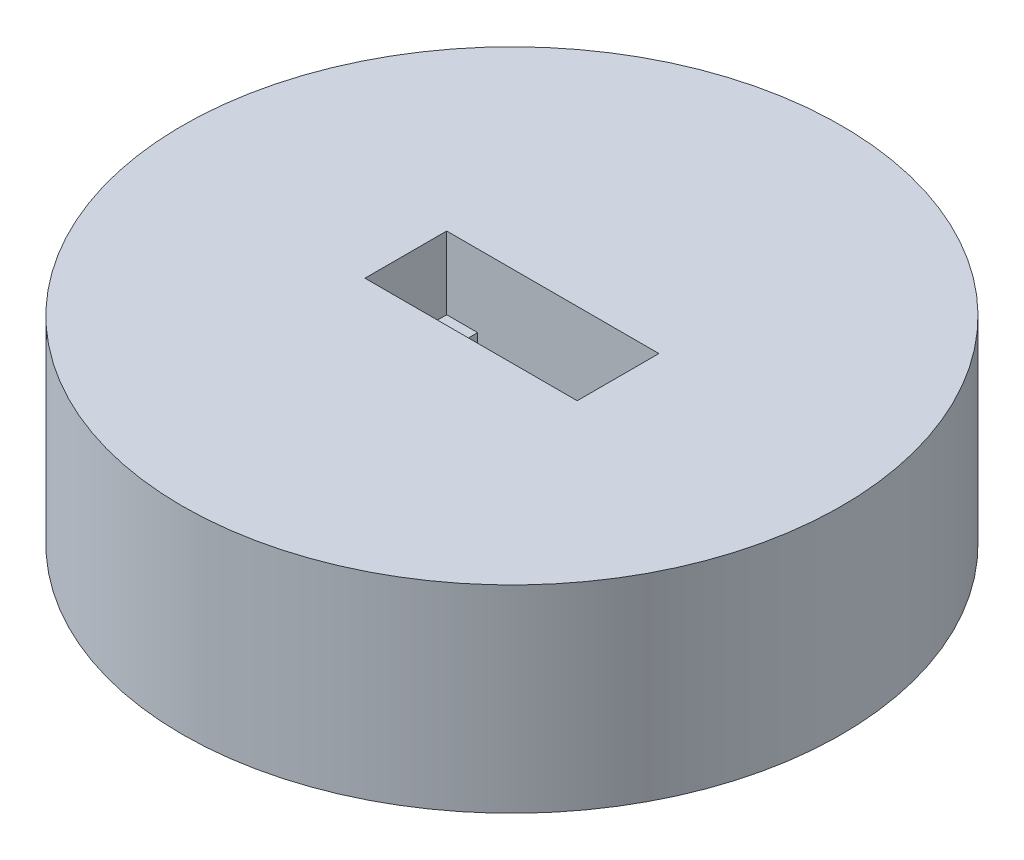
ISO-10303-21;
HEADER;
FILE_DESCRIPTION(('STEP AP214'),'2;1');
FILE_NAME('part.step','',(''),(''),'','','');
FILE_SCHEMA(('AUTOMOTIVE_DESIGN { 1 0 10303 214 1 1 1 1 }'));
ENDSEC;
DATA;
#1=APPLICATION_CONTEXT('core data for automotive mechanical design processes');
#2=APPLICATION_PROTOCOL_DEFINITION('international standard','automotive_design',2000,#1);
#3=PRODUCT_CONTEXT('',#1,'mechanical');
#4=PRODUCT('Part','Part','',(#3));
#5=PRODUCT_RELATED_PRODUCT_CATEGORY('part','',(#4));
#6=PRODUCT_DEFINITION_FORMATION('','',#4);
#7=PRODUCT_DEFINITION_CONTEXT('part definition',#1,'design');
#8=PRODUCT_DEFINITION('design','',#6,#7);
#9=PRODUCT_DEFINITION_SHAPE('','',#8);
#10=(LENGTH_UNIT() NAMED_UNIT(*) SI_UNIT(.MILLI.,.METRE.));
#11=(NAMED_UNIT(*) PLANE_ANGLE_UNIT() SI_UNIT($,.RADIAN.));
#12=(NAMED_UNIT(*) SI_UNIT($,.STERADIAN.) SOLID_ANGLE_UNIT());
#13=UNCERTAINTY_MEASURE_WITH_UNIT(LENGTH_MEASURE(1.E-05),#10,'distance_accuracy_value','');
#14=(GEOMETRIC_REPRESENTATION_CONTEXT(3) GLOBAL_UNCERTAINTY_ASSIGNED_CONTEXT((#13)) GLOBAL_UNIT_ASSIGNED_CONTEXT((#10,
#11,#12)) REPRESENTATION_CONTEXT('',''));
#15=CARTESIAN_POINT('',(0.,0.,0.));
#16=DIRECTION('',(0.,0.,1.));
#17=DIRECTION('',(1.,0.,0.));
#18=AXIS2_PLACEMENT_3D('',#15,#16,#17);
#19=CARTESIAN_POINT('',(-50.,7.5,2.));
#20=DIRECTION('',(0.,0.,1.));
#21=DIRECTION('',(1.,0.,0.));
#22=AXIS2_PLACEMENT_3D('',#19,#20,#21);
#23=PLANE('',#22);
#24=DIRECTION('',(0.,-1.,0.));
#25=VECTOR('',#24,1.);
#26=CARTESIAN_POINT('',(-19.1,7.5,2.));
#27=LINE('',#26,#25);
#28=CARTESIAN_POINT('',(-19.1,9.,2.));
#29=VERTEX_POINT('',#28);
#30=CARTESIAN_POINT('',(-19.1,7.5,2.));
#31=VERTEX_POINT('',#30);
#32=EDGE_CURVE('E66',#29,#31,#27,.T.);
#33=ORIENTED_EDGE('',*,*,#32,.F.);
#34=DIRECTION('',(1.,0.,0.));
#35=VECTOR('',#34,1.);
#36=CARTESIAN_POINT('',(-50.,9.,2.));
#37=LINE('',#36,#35);
#38=CARTESIAN_POINT('',(-11.4,9.,2.));
#39=VERTEX_POINT('',#38);
#40=EDGE_CURVE('E311',#29,#39,#37,.T.);
#41=ORIENTED_EDGE('',*,*,#40,.T.);
#42=DIRECTION('',(0.,1.,0.));
#43=VECTOR('',#42,1.);
#44=CARTESIAN_POINT('',(-11.4,3.,2.));
#45=LINE('',#44,#43);
#46=CARTESIAN_POINT('',(-11.4,7.5,2.));
#47=VERTEX_POINT('',#46);
#48=EDGE_CURVE('E281',#47,#39,#45,.T.);
#49=ORIENTED_EDGE('',*,*,#48,.F.);
#50=DIRECTION('',(1.,0.,0.));
#51=VECTOR('',#50,1.);
#52=CARTESIAN_POINT('',(-50.,7.5,2.));
#53=LINE('',#52,#51);
#54=EDGE_CURVE('E202',#31,#47,#53,.T.);
#55=ORIENTED_EDGE('',*,*,#54,.F.);
#56=EDGE_LOOP('',(#33,#41,#49,#55));
#57=FACE_BOUND('',#56,.T.);
#58=ADVANCED_FACE('F43',(#57),#23,.F.);
#59=CARTESIAN_POINT('',(-50.,9.,-2.));
#60=DIRECTION('',(0.,1.,0.));
#61=DIRECTION('',(0.,0.,1.));
#62=AXIS2_PLACEMENT_3D('',#59,#60,#61);
#63=PLANE('',#62);
#64=DIRECTION('',(0.,0.,1.));
#65=VECTOR('',#64,1.);
#66=CARTESIAN_POINT('',(-19.1,9.,-2.));
#67=LINE('',#66,#65);
#68=CARTESIAN_POINT('',(-19.1,9.,-2.));
#69=VERTEX_POINT('',#68);
#70=EDGE_CURVE('E299',#69,#29,#67,.T.);
#71=ORIENTED_EDGE('',*,*,#70,.F.);
#72=DIRECTION('',(1.,0.,0.));
#73=VECTOR('',#72,1.);
#74=CARTESIAN_POINT('',(-50.,9.,-2.));
#75=LINE('',#74,#73);
#76=CARTESIAN_POINT('',(-11.4,9.,-2.));
#77=VERTEX_POINT('',#76);
#78=EDGE_CURVE('E297',#69,#77,#75,.T.);
#79=ORIENTED_EDGE('',*,*,#78,.T.);
#80=DIRECTION('',(0.,0.,-1.));
#81=VECTOR('',#80,1.);
#82=CARTESIAN_POINT('',(-11.4,9.,-6.2));
#83=LINE('',#82,#81);
#84=EDGE_CURVE('E277',#39,#77,#83,.T.);
#85=ORIENTED_EDGE('',*,*,#84,.F.);
#86=ORIENTED_EDGE('',*,*,#40,.F.);
#87=EDGE_LOOP('',(#71,#79,#85,#86));
#88=FACE_BOUND('',#87,.T.);
#89=ADVANCED_FACE('F310',(#88),#63,.F.);
#90=CARTESIAN_POINT('',(-50.,7.5,-2.));
#91=DIRECTION('',(0.,0.,-1.));
#92=DIRECTION('',(-1.,0.,0.));
#93=AXIS2_PLACEMENT_3D('',#90,#91,#92);
#94=PLANE('',#93);
#95=DIRECTION('',(0.,1.,0.));
#96=VECTOR('',#95,1.);
#97=CARTESIAN_POINT('',(-19.1,7.5,-2.));
#98=LINE('',#97,#96);
#99=CARTESIAN_POINT('',(-19.1,7.5,-2.));
#100=VERTEX_POINT('',#99);
#101=EDGE_CURVE('E287',#100,#69,#98,.T.);
#102=ORIENTED_EDGE('',*,*,#101,.F.);
#103=DIRECTION('',(1.,0.,0.));
#104=VECTOR('',#103,1.);
#105=CARTESIAN_POINT('',(-50.,7.5,-2.));
#106=LINE('',#105,#104);
#107=CARTESIAN_POINT('',(-11.4,7.5,-2.));
#108=VERTEX_POINT('',#107);
#109=EDGE_CURVE('E201',#100,#108,#106,.T.);
#110=ORIENTED_EDGE('',*,*,#109,.T.);
#111=DIRECTION('',(0.,-1.,0.));
#112=VECTOR('',#111,1.);
#113=CARTESIAN_POINT('',(-11.4,3.,-2.));
#114=LINE('',#113,#112);
#115=EDGE_CURVE('E273',#77,#108,#114,.T.);
#116=ORIENTED_EDGE('',*,*,#115,.F.);
#117=ORIENTED_EDGE('',*,*,#78,.F.);
#118=EDGE_LOOP('',(#102,#110,#116,#117));
#119=FACE_BOUND('',#118,.T.);
#120=ADVANCED_FACE('F294',(#119),#94,.F.);
#121=CARTESIAN_POINT('',(-50.,7.5,-2.));
#122=DIRECTION('',(0.,-1.,0.));
#123=DIRECTION('',(0.,0.,-1.));
#124=AXIS2_PLACEMENT_3D('',#121,#122,#123);
#125=PLANE('',#124);
#126=DIRECTION('',(0.,0.,-1.));
#127=VECTOR('',#126,1.);
#128=CARTESIAN_POINT('',(-19.1,7.5,-2.));
#129=LINE('',#128,#127);
#130=EDGE_CURVE('E52',#31,#100,#129,.T.);
#131=ORIENTED_EDGE('',*,*,#130,.F.);
#132=ORIENTED_EDGE('',*,*,#54,.T.);
#133=DIRECTION('',(0.,0.,1.));
#134=VECTOR('',#133,1.);
#135=CARTESIAN_POINT('',(-11.4,7.5,-6.2));
#136=LINE('',#135,#134);
#137=EDGE_CURVE('E266',#108,#47,#136,.T.);
#138=ORIENTED_EDGE('',*,*,#137,.F.);
#139=ORIENTED_EDGE('',*,*,#109,.F.);
#140=EDGE_LOOP('',(#131,#132,#138,#139));
#141=FACE_BOUND('',#140,.T.);
#142=ADVANCED_FACE('F302',(#141),#125,.F.);
#143=CARTESIAN_POINT('',(0.,30.,0.));
#144=DIRECTION('',(0.,-1.,0.));
#145=DIRECTION('',(0.,0.,-1.));
#146=AXIS2_PLACEMENT_3D('',#143,#144,#145);
#147=CYLINDRICAL_SURFACE('',#146,50.);
#148=DIRECTION('',(0.,-1.,0.));
#149=VECTOR('',#148,1.);
#150=CARTESIAN_POINT('',(-49.9599839871872,30.,2.));
#151=LINE('',#150,#149);
#152=CARTESIAN_POINT('',(-49.9599839871872,9.,2.));
#153=VERTEX_POINT('',#152);
#154=CARTESIAN_POINT('',(-49.9599839871872,7.5,2.));
#155=VERTEX_POINT('',#154);
#156=EDGE_CURVE('E220',#153,#155,#151,.T.);
#157=ORIENTED_EDGE('',*,*,#156,.T.);
#158=CARTESIAN_POINT('',(0.,7.5,0.));
#159=DIRECTION('',(0.,-1.,0.));
#160=DIRECTION('',(0.,0.,-1.));
#161=AXIS2_PLACEMENT_3D('',#158,#159,#160);
#162=CIRCLE('',#161,50.);
#163=CARTESIAN_POINT('',(-49.9599839871872,7.5,-2.));
#164=VERTEX_POINT('',#163);
#165=EDGE_CURVE('E199',#155,#164,#162,.T.);
#166=ORIENTED_EDGE('',*,*,#165,.T.);
#167=DIRECTION('',(0.,-1.,0.));
#168=VECTOR('',#167,1.);
#169=CARTESIAN_POINT('',(-49.9599839871872,30.,-2.));
#170=LINE('',#169,#168);
#171=CARTESIAN_POINT('',(-49.9599839871872,9.,-2.));
#172=VERTEX_POINT('',#171);
#173=EDGE_CURVE('E213',#164,#172,#170,.F.);
#174=ORIENTED_EDGE('',*,*,#173,.T.);
#175=CARTESIAN_POINT('',(0.,9.,0.));
#176=DIRECTION('',(0.,1.,0.));
#177=DIRECTION('',(0.,0.,1.));
#178=AXIS2_PLACEMENT_3D('',#175,#176,#177);
#179=CIRCLE('',#178,50.);
#180=EDGE_CURVE('E217',#172,#153,#179,.T.);
#181=ORIENTED_EDGE('',*,*,#180,.T.);
#182=EDGE_LOOP('',(#157,#166,#174,#181));
#183=FACE_BOUND('',#182,.T.);
#184=CARTESIAN_POINT('',(0.,30.,0.));
#185=DIRECTION('',(0.,1.,0.));
#186=DIRECTION('',(0.,0.,1.));
#187=AXIS2_PLACEMENT_3D('',#184,#185,#186);
#188=CIRCLE('',#187,50.);
#189=CARTESIAN_POINT('',(0.,30.,50.));
#190=VERTEX_POINT('',#189);
#191=EDGE_CURVE('E262',#190,#190,#188,.T.);
#192=ORIENTED_EDGE('',*,*,#191,.F.);
#193=EDGE_LOOP('',(#192));
#194=FACE_BOUND('',#193,.T.);
#195=CARTESIAN_POINT('',(0.,0.,0.));
#196=DIRECTION('',(0.,1.,0.));
#197=DIRECTION('',(0.,0.,1.));
#198=AXIS2_PLACEMENT_3D('',#195,#196,#197);
#199=CIRCLE('',#198,50.);
#200=CARTESIAN_POINT('',(0.,0.,50.));
#201=VERTEX_POINT('',#200);
#202=EDGE_CURVE('E250',#201,#201,#199,.T.);
#203=ORIENTED_EDGE('',*,*,#202,.T.);
#204=EDGE_LOOP('',(#203));
#205=FACE_BOUND('',#204,.T.);
#206=ADVANCED_FACE('F45',(#183,#194,#205),#147,.T.);
#207=CARTESIAN_POINT('',(0.,30.,0.));
#208=DIRECTION('',(0.,1.,0.));
#209=DIRECTION('',(0.,0.,1.));
#210=AXIS2_PLACEMENT_3D('',#207,#208,#209);
#211=PLANE('',#210);
#212=DIRECTION('',(0.,0.,1.));
#213=VECTOR('',#212,1.);
#214=CARTESIAN_POINT('',(-16.1,30.,-6.2));
#215=LINE('',#214,#213);
#216=CARTESIAN_POINT('',(-16.1,30.,-6.2));
#217=VERTEX_POINT('',#216);
#218=CARTESIAN_POINT('',(-16.1,30.,6.2));
#219=VERTEX_POINT('',#218);
#220=EDGE_CURVE('E349',#217,#219,#215,.T.);
#221=ORIENTED_EDGE('',*,*,#220,.F.);
#222=DIRECTION('',(-1.,0.,0.));
#223=VECTOR('',#222,1.);
#224=CARTESIAN_POINT('',(11.4,30.,-6.2));
#225=LINE('',#224,#223);
#226=CARTESIAN_POINT('',(16.1,30.,-6.2));
#227=VERTEX_POINT('',#226);
#228=EDGE_CURVE('E229',#227,#217,#225,.T.);
#229=ORIENTED_EDGE('',*,*,#228,.F.);
#230=DIRECTION('',(0.,0.,-1.));
#231=VECTOR('',#230,1.);
#232=CARTESIAN_POINT('',(16.1,30.,-6.2));
#233=LINE('',#232,#231);
#234=CARTESIAN_POINT('',(16.1,30.,6.2));
#235=VERTEX_POINT('',#234);
#236=EDGE_CURVE('E344',#235,#227,#233,.T.);
#237=ORIENTED_EDGE('',*,*,#236,.F.);
#238=DIRECTION('',(1.,0.,0.));
#239=VECTOR('',#238,1.);
#240=CARTESIAN_POINT('',(11.4,30.,6.2));
#241=LINE('',#240,#239);
#242=EDGE_CURVE('E223',#219,#235,#241,.T.);
#243=ORIENTED_EDGE('',*,*,#242,.F.);
#244=EDGE_LOOP('',(#221,#229,#237,#243));
#245=FACE_BOUND('',#244,.T.);
#246=ORIENTED_EDGE('',*,*,#191,.T.);
#247=EDGE_LOOP('',(#246));
#248=FACE_BOUND('',#247,.T.);
#249=ADVANCED_FACE('F486',(#245,#248),#211,.T.);
#250=CARTESIAN_POINT('',(0.,0.,0.));
#251=DIRECTION('',(0.,1.,0.));
#252=DIRECTION('',(0.,0.,1.));
#253=AXIS2_PLACEMENT_3D('',#250,#251,#252);
#254=PLANE('',#253);
#255=ORIENTED_EDGE('',*,*,#202,.F.);
#256=EDGE_LOOP('',(#255));
#257=FACE_BOUND('',#256,.T.);
#258=ADVANCED_FACE('F485',(#257),#254,.F.);
#259=CARTESIAN_POINT('',(-11.4,3.,-6.2));
#260=DIRECTION('',(-1.,0.,0.));
#261=DIRECTION('',(0.,0.,1.));
#262=AXIS2_PLACEMENT_3D('',#259,#260,#261);
#263=PLANE('',#262);
#264=ORIENTED_EDGE('',*,*,#137,.T.);
#265=ORIENTED_EDGE('',*,*,#48,.T.);
#266=ORIENTED_EDGE('',*,*,#84,.T.);
#267=ORIENTED_EDGE('',*,*,#115,.T.);
#268=EDGE_LOOP('',(#264,#265,#266,#267));
#269=FACE_BOUND('',#268,.T.);
#270=DIRECTION('',(0.,1.,0.));
#271=VECTOR('',#270,1.);
#272=CARTESIAN_POINT('',(-11.4,3.,-6.2));
#273=LINE('',#272,#271);
#274=CARTESIAN_POINT('',(-11.4,3.,-6.2));
#275=VERTEX_POINT('',#274);
#276=CARTESIAN_POINT('',(-11.4,19.,-6.2));
#277=VERTEX_POINT('',#276);
#278=EDGE_CURVE('E246',#275,#277,#273,.T.);
#279=ORIENTED_EDGE('',*,*,#278,.T.);
#280=DIRECTION('',(0.,0.,1.));
#281=VECTOR('',#280,1.);
#282=CARTESIAN_POINT('',(-11.4,19.,-6.2));
#283=LINE('',#282,#281);
#284=CARTESIAN_POINT('',(-11.4,19.,6.2));
#285=VERTEX_POINT('',#284);
#286=EDGE_CURVE('E208',#277,#285,#283,.T.);
#287=ORIENTED_EDGE('',*,*,#286,.T.);
#288=DIRECTION('',(0.,1.,0.));
#289=VECTOR('',#288,1.);
#290=CARTESIAN_POINT('',(-11.4,3.,6.2));
#291=LINE('',#290,#289);
#292=CARTESIAN_POINT('',(-11.4,3.,6.2));
#293=VERTEX_POINT('',#292);
#294=EDGE_CURVE('E241',#293,#285,#291,.T.);
#295=ORIENTED_EDGE('',*,*,#294,.F.);
#296=DIRECTION('',(0.,0.,1.));
#297=VECTOR('',#296,1.);
#298=CARTESIAN_POINT('',(-11.4,3.,-6.2));
#299=LINE('',#298,#297);
#300=EDGE_CURVE('E224',#275,#293,#299,.T.);
#301=ORIENTED_EDGE('',*,*,#300,.F.);
#302=EDGE_LOOP('',(#279,#287,#295,#301));
#303=FACE_BOUND('',#302,.T.);
#304=ADVANCED_FACE('F305',(#269,#303),#263,.F.);
#305=CARTESIAN_POINT('',(11.4,3.,-6.2));
#306=DIRECTION('',(0.,0.,-1.));
#307=DIRECTION('',(-1.,0.,0.));
#308=AXIS2_PLACEMENT_3D('',#305,#306,#307);
#309=PLANE('',#308);
#310=DIRECTION('',(0.,1.,0.));
#311=VECTOR('',#310,1.);
#312=CARTESIAN_POINT('',(11.4,3.,-6.2));
#313=LINE('',#312,#311);
#314=CARTESIAN_POINT('',(11.4,3.,-6.2));
#315=VERTEX_POINT('',#314);
#316=CARTESIAN_POINT('',(11.4,19.,-6.2));
#317=VERTEX_POINT('',#316);
#318=EDGE_CURVE('E251',#315,#317,#313,.T.);
#319=ORIENTED_EDGE('',*,*,#318,.T.);
#320=DIRECTION('',(-1.,0.,0.));
#321=VECTOR('',#320,1.);
#322=CARTESIAN_POINT('',(16.1,19.,-6.2));
#323=LINE('',#322,#321);
#324=CARTESIAN_POINT('',(16.1,19.,-6.2));
#325=VERTEX_POINT('',#324);
#326=EDGE_CURVE('E333',#325,#317,#323,.T.);
#327=ORIENTED_EDGE('',*,*,#326,.F.);
#328=DIRECTION('',(0.,1.,0.));
#329=VECTOR('',#328,1.);
#330=CARTESIAN_POINT('',(16.1,19.,-6.2));
#331=LINE('',#330,#329);
#332=EDGE_CURVE('E337',#325,#227,#331,.T.);
#333=ORIENTED_EDGE('',*,*,#332,.T.);
#334=ORIENTED_EDGE('',*,*,#228,.T.);
#335=DIRECTION('',(0.,1.,0.));
#336=VECTOR('',#335,1.);
#337=CARTESIAN_POINT('',(-16.1,19.,-6.2));
#338=LINE('',#337,#336);
#339=CARTESIAN_POINT('',(-16.1,19.,-6.2));
#340=VERTEX_POINT('',#339);
#341=EDGE_CURVE('E327',#340,#217,#338,.T.);
#342=ORIENTED_EDGE('',*,*,#341,.F.);
#343=EDGE_CURVE('E355',#277,#340,#323,.T.);
#344=ORIENTED_EDGE('',*,*,#343,.F.);
#345=ORIENTED_EDGE('',*,*,#278,.F.);
#346=DIRECTION('',(-1.,0.,0.));
#347=VECTOR('',#346,1.);
#348=CARTESIAN_POINT('',(11.4,3.,-6.2));
#349=LINE('',#348,#347);
#350=EDGE_CURVE('E237',#315,#275,#349,.T.);
#351=ORIENTED_EDGE('',*,*,#350,.F.);
#352=EDGE_LOOP('',(#319,#327,#333,#334,#342,#344,#345,#351));
#353=FACE_BOUND('',#352,.T.);
#354=ADVANCED_FACE('F476',(#353),#309,.F.);
#355=CARTESIAN_POINT('',(11.4,3.,-6.2));
#356=DIRECTION('',(1.,0.,0.));
#357=DIRECTION('',(0.,0.,-1.));
#358=AXIS2_PLACEMENT_3D('',#355,#356,#357);
#359=PLANE('',#358);
#360=DIRECTION('',(0.,1.,0.));
#361=VECTOR('',#360,1.);
#362=CARTESIAN_POINT('',(11.4,3.,6.2));
#363=LINE('',#362,#361);
#364=CARTESIAN_POINT('',(11.4,3.,6.2));
#365=VERTEX_POINT('',#364);
#366=CARTESIAN_POINT('',(11.4,19.,6.2));
#367=VERTEX_POINT('',#366);
#368=EDGE_CURVE('E255',#365,#367,#363,.T.);
#369=ORIENTED_EDGE('',*,*,#368,.T.);
#370=DIRECTION('',(0.,0.,-1.));
#371=VECTOR('',#370,1.);
#372=CARTESIAN_POINT('',(11.4,19.,-6.2));
#373=LINE('',#372,#371);
#374=EDGE_CURVE('E323',#367,#317,#373,.T.);
#375=ORIENTED_EDGE('',*,*,#374,.T.);
#376=ORIENTED_EDGE('',*,*,#318,.F.);
#377=DIRECTION('',(0.,0.,-1.));
#378=VECTOR('',#377,1.);
#379=CARTESIAN_POINT('',(11.4,3.,-6.2));
#380=LINE('',#379,#378);
#381=EDGE_CURVE('E233',#365,#315,#380,.T.);
#382=ORIENTED_EDGE('',*,*,#381,.F.);
#383=EDGE_LOOP('',(#369,#375,#376,#382));
#384=FACE_BOUND('',#383,.T.);
#385=ADVANCED_FACE('F472',(#384),#359,.F.);
#386=CARTESIAN_POINT('',(11.4,3.,6.2));
#387=DIRECTION('',(0.,0.,1.));
#388=DIRECTION('',(1.,0.,0.));
#389=AXIS2_PLACEMENT_3D('',#386,#387,#388);
#390=PLANE('',#389);
#391=ORIENTED_EDGE('',*,*,#294,.T.);
#392=DIRECTION('',(1.,0.,0.));
#393=VECTOR('',#392,1.);
#394=CARTESIAN_POINT('',(16.1,19.,6.2));
#395=LINE('',#394,#393);
#396=CARTESIAN_POINT('',(-16.1,19.,6.2));
#397=VERTEX_POINT('',#396);
#398=EDGE_CURVE('E360',#397,#285,#395,.T.);
#399=ORIENTED_EDGE('',*,*,#398,.F.);
#400=DIRECTION('',(0.,1.,0.));
#401=VECTOR('',#400,1.);
#402=CARTESIAN_POINT('',(-16.1,19.,6.2));
#403=LINE('',#402,#401);
#404=EDGE_CURVE('E328',#397,#219,#403,.T.);
#405=ORIENTED_EDGE('',*,*,#404,.T.);
#406=ORIENTED_EDGE('',*,*,#242,.T.);
#407=DIRECTION('',(0.,1.,0.));
#408=VECTOR('',#407,1.);
#409=CARTESIAN_POINT('',(16.1,19.,6.2));
#410=LINE('',#409,#408);
#411=CARTESIAN_POINT('',(16.1,19.,6.2));
#412=VERTEX_POINT('',#411);
#413=EDGE_CURVE('E332',#412,#235,#410,.T.);
#414=ORIENTED_EDGE('',*,*,#413,.F.);
#415=EDGE_CURVE('E363',#367,#412,#395,.T.);
#416=ORIENTED_EDGE('',*,*,#415,.F.);
#417=ORIENTED_EDGE('',*,*,#368,.F.);
#418=DIRECTION('',(1.,0.,0.));
#419=VECTOR('',#418,1.);
#420=CARTESIAN_POINT('',(11.4,3.,6.2));
#421=LINE('',#420,#419);
#422=EDGE_CURVE('E228',#293,#365,#421,.T.);
#423=ORIENTED_EDGE('',*,*,#422,.F.);
#424=EDGE_LOOP('',(#391,#399,#405,#406,#414,#416,#417,#423));
#425=FACE_BOUND('',#424,.T.);
#426=ADVANCED_FACE('F467',(#425),#390,.F.);
#427=CARTESIAN_POINT('',(0.,3.,0.));
#428=DIRECTION('',(0.,-1.,0.));
#429=DIRECTION('',(0.,0.,-1.));
#430=AXIS2_PLACEMENT_3D('',#427,#428,#429);
#431=PLANE('',#430);
#432=ORIENTED_EDGE('',*,*,#300,.T.);
#433=ORIENTED_EDGE('',*,*,#422,.T.);
#434=ORIENTED_EDGE('',*,*,#381,.T.);
#435=ORIENTED_EDGE('',*,*,#350,.T.);
#436=EDGE_LOOP('',(#432,#433,#434,#435));
#437=FACE_BOUND('',#436,.T.);
#438=ADVANCED_FACE('F460',(#437),#431,.F.);
#439=CARTESIAN_POINT('',(-44.9555335859781,9.,2.));
#440=VERTEX_POINT('',#439);
#441=EDGE_CURVE('E193',#153,#440,#37,.T.);
#442=ORIENTED_EDGE('',*,*,#441,.T.);
#443=DIRECTION('',(0.,1.,0.));
#444=VECTOR('',#443,1.);
#445=CARTESIAN_POINT('',(-44.9555335859781,2.,2.));
#446=LINE('',#445,#444);
#447=CARTESIAN_POINT('',(-44.9555335859781,7.5,2.));
#448=VERTEX_POINT('',#447);
#449=EDGE_CURVE('E179',#440,#448,#446,.F.);
#450=ORIENTED_EDGE('',*,*,#449,.T.);
#451=EDGE_CURVE('E190',#155,#448,#53,.T.);
#452=ORIENTED_EDGE('',*,*,#451,.F.);
#453=ORIENTED_EDGE('',*,*,#156,.F.);
#454=EDGE_LOOP('',(#442,#450,#452,#453));
#455=FACE_BOUND('',#454,.T.);
#456=ADVANCED_FACE('F188',(#455),#23,.F.);
#457=CARTESIAN_POINT('',(-44.9555335859781,9.,-2.));
#458=VERTEX_POINT('',#457);
#459=EDGE_CURVE('E313',#172,#458,#75,.T.);
#460=ORIENTED_EDGE('',*,*,#459,.T.);
#461=CARTESIAN_POINT('',(0.,9.,0.));
#462=DIRECTION('',(0.,1.,0.));
#463=DIRECTION('',(0.,0.,1.));
#464=AXIS2_PLACEMENT_3D('',#461,#462,#463);
#465=CIRCLE('',#464,45.);
#466=EDGE_CURVE('E196',#458,#440,#465,.T.);
#467=ORIENTED_EDGE('',*,*,#466,.T.);
#468=ORIENTED_EDGE('',*,*,#441,.F.);
#469=ORIENTED_EDGE('',*,*,#180,.F.);
#470=EDGE_LOOP('',(#460,#467,#468,#469));
#471=FACE_BOUND('',#470,.T.);
#472=ADVANCED_FACE('F456',(#471),#63,.F.);
#473=CARTESIAN_POINT('',(-44.9555335859781,7.5,-2.));
#474=VERTEX_POINT('',#473);
#475=EDGE_CURVE('E206',#164,#474,#106,.T.);
#476=ORIENTED_EDGE('',*,*,#475,.T.);
#477=DIRECTION('',(0.,1.,0.));
#478=VECTOR('',#477,1.);
#479=CARTESIAN_POINT('',(-44.9555335859781,2.,-2.));
#480=LINE('',#479,#478);
#481=EDGE_CURVE('E59',#474,#458,#480,.T.);
#482=ORIENTED_EDGE('',*,*,#481,.T.);
#483=ORIENTED_EDGE('',*,*,#459,.F.);
#484=ORIENTED_EDGE('',*,*,#173,.F.);
#485=EDGE_LOOP('',(#476,#482,#483,#484));
#486=FACE_BOUND('',#485,.T.);
#487=ADVANCED_FACE('F465',(#486),#94,.F.);
#488=ORIENTED_EDGE('',*,*,#451,.T.);
#489=CARTESIAN_POINT('',(0.,7.5,0.));
#490=DIRECTION('',(0.,-1.,0.));
#491=DIRECTION('',(0.,0.,-1.));
#492=AXIS2_PLACEMENT_3D('',#489,#490,#491);
#493=CIRCLE('',#492,45.);
#494=EDGE_CURVE('E11',#448,#474,#493,.T.);
#495=ORIENTED_EDGE('',*,*,#494,.T.);
#496=ORIENTED_EDGE('',*,*,#475,.F.);
#497=ORIENTED_EDGE('',*,*,#165,.F.);
#498=EDGE_LOOP('',(#488,#495,#496,#497));
#499=FACE_BOUND('',#498,.T.);
#500=ADVANCED_FACE('F198',(#499),#125,.F.);
#501=CARTESIAN_POINT('',(0.,19.,0.));
#502=DIRECTION('',(0.,-1.,0.));
#503=DIRECTION('',(0.,0.,-1.));
#504=AXIS2_PLACEMENT_3D('',#501,#502,#503);
#505=PLANE('',#504);
#506=ORIENTED_EDGE('',*,*,#415,.T.);
#507=DIRECTION('',(0.,0.,-1.));
#508=VECTOR('',#507,1.);
#509=CARTESIAN_POINT('',(16.1,19.,-6.2));
#510=LINE('',#509,#508);
#511=EDGE_CURVE('E356',#412,#325,#510,.T.);
#512=ORIENTED_EDGE('',*,*,#511,.T.);
#513=ORIENTED_EDGE('',*,*,#326,.T.);
#514=ORIENTED_EDGE('',*,*,#374,.F.);
#515=EDGE_LOOP('',(#506,#512,#513,#514));
#516=FACE_BOUND('',#515,.T.);
#517=ADVANCED_FACE('F511',(#516),#505,.F.);
#518=CARTESIAN_POINT('',(16.1,19.,-6.2));
#519=DIRECTION('',(1.,0.,0.));
#520=DIRECTION('',(0.,0.,-1.));
#521=AXIS2_PLACEMENT_3D('',#518,#519,#520);
#522=PLANE('',#521);
#523=ORIENTED_EDGE('',*,*,#236,.T.);
#524=ORIENTED_EDGE('',*,*,#332,.F.);
#525=ORIENTED_EDGE('',*,*,#511,.F.);
#526=ORIENTED_EDGE('',*,*,#413,.T.);
#527=EDGE_LOOP('',(#523,#524,#525,#526));
#528=FACE_BOUND('',#527,.T.);
#529=ADVANCED_FACE('F658',(#528),#522,.F.);
#530=ORIENTED_EDGE('',*,*,#343,.T.);
#531=DIRECTION('',(0.,0.,1.));
#532=VECTOR('',#531,1.);
#533=CARTESIAN_POINT('',(-16.1,19.,-6.2));
#534=LINE('',#533,#532);
#535=EDGE_CURVE('E348',#340,#397,#534,.T.);
#536=ORIENTED_EDGE('',*,*,#535,.T.);
#537=ORIENTED_EDGE('',*,*,#398,.T.);
#538=ORIENTED_EDGE('',*,*,#286,.F.);
#539=EDGE_LOOP('',(#530,#536,#537,#538));
#540=FACE_BOUND('',#539,.T.);
#541=ADVANCED_FACE('F647',(#540),#505,.F.);
#542=CARTESIAN_POINT('',(-16.1,19.,-6.2));
#543=DIRECTION('',(-1.,0.,0.));
#544=DIRECTION('',(0.,0.,1.));
#545=AXIS2_PLACEMENT_3D('',#542,#543,#544);
#546=PLANE('',#545);
#547=ORIENTED_EDGE('',*,*,#220,.T.);
#548=ORIENTED_EDGE('',*,*,#404,.F.);
#549=ORIENTED_EDGE('',*,*,#535,.F.);
#550=ORIENTED_EDGE('',*,*,#341,.T.);
#551=EDGE_LOOP('',(#547,#548,#549,#550));
#552=FACE_BOUND('',#551,.T.);
#553=ADVANCED_FACE('F531',(#552),#546,.F.);
#554=CARTESIAN_POINT('',(-19.1,2.,-9.2));
#555=DIRECTION('',(-1.,0.,0.));
#556=DIRECTION('',(0.,0.,1.));
#557=AXIS2_PLACEMENT_3D('',#554,#555,#556);
#558=PLANE('',#557);
#559=DIRECTION('',(0.,0.,1.));
#560=VECTOR('',#559,1.);
#561=CARTESIAN_POINT('',(-19.1,27.,-9.2));
#562=LINE('',#561,#560);
#563=CARTESIAN_POINT('',(-19.1,27.,-9.2));
#564=VERTEX_POINT('',#563);
#565=CARTESIAN_POINT('',(-19.1,27.,9.2));
#566=VERTEX_POINT('',#565);
#567=EDGE_CURVE('E195',#564,#566,#562,.T.);
#568=ORIENTED_EDGE('',*,*,#567,.F.);
#569=DIRECTION('',(0.,1.,0.));
#570=VECTOR('',#569,1.);
#571=CARTESIAN_POINT('',(-19.1,2.,-9.2));
#572=LINE('',#571,#570);
#573=CARTESIAN_POINT('',(-19.1,2.,-9.2));
#574=VERTEX_POINT('',#573);
#575=EDGE_CURVE('E300',#574,#564,#572,.T.);
#576=ORIENTED_EDGE('',*,*,#575,.F.);
#577=DIRECTION('',(0.,0.,1.));
#578=VECTOR('',#577,1.);
#579=CARTESIAN_POINT('',(-19.1,2.,-9.2));
#580=LINE('',#579,#578);
#581=CARTESIAN_POINT('',(-19.1,2.,9.2));
#582=VERTEX_POINT('',#581);
#583=EDGE_CURVE('E388',#574,#582,#580,.T.);
#584=ORIENTED_EDGE('',*,*,#583,.T.);
#585=DIRECTION('',(0.,1.,0.));
#586=VECTOR('',#585,1.);
#587=CARTESIAN_POINT('',(-19.1,2.,9.2));
#588=LINE('',#587,#586);
#589=EDGE_CURVE('E371',#582,#566,#588,.T.);
#590=ORIENTED_EDGE('',*,*,#589,.T.);
#591=EDGE_LOOP('',(#568,#576,#584,#590));
#592=FACE_BOUND('',#591,.T.);
#593=ORIENTED_EDGE('',*,*,#32,.T.);
#594=ORIENTED_EDGE('',*,*,#130,.T.);
#595=ORIENTED_EDGE('',*,*,#101,.T.);
#596=ORIENTED_EDGE('',*,*,#70,.T.);
#597=EDGE_LOOP('',(#593,#594,#595,#596));
#598=FACE_BOUND('',#597,.T.);
#599=ADVANCED_FACE('F286',(#592,#598),#558,.T.);
#600=CARTESIAN_POINT('',(0.,2.,0.));
#601=DIRECTION('',(0.,-1.,0.));
#602=DIRECTION('',(0.,0.,-1.));
#603=AXIS2_PLACEMENT_3D('',#600,#601,#602);
#604=PLANE('',#603);
#605=ORIENTED_EDGE('',*,*,#583,.F.);
#606=DIRECTION('',(-1.,0.,0.));
#607=VECTOR('',#606,1.);
#608=CARTESIAN_POINT('',(19.1,2.,-9.2));
#609=LINE('',#608,#607);
#610=CARTESIAN_POINT('',(19.1,2.,-9.2));
#611=VERTEX_POINT('',#610);
#612=EDGE_CURVE('E376',#611,#574,#609,.T.);
#613=ORIENTED_EDGE('',*,*,#612,.F.);
#614=DIRECTION('',(0.,0.,-1.));
#615=VECTOR('',#614,1.);
#616=CARTESIAN_POINT('',(19.1,2.,-9.2));
#617=LINE('',#616,#615);
#618=CARTESIAN_POINT('',(19.1,2.,9.2));
#619=VERTEX_POINT('',#618);
#620=EDGE_CURVE('E402',#619,#611,#617,.T.);
#621=ORIENTED_EDGE('',*,*,#620,.F.);
#622=DIRECTION('',(1.,0.,0.));
#623=VECTOR('',#622,1.);
#624=CARTESIAN_POINT('',(19.1,2.,9.2));
#625=LINE('',#624,#623);
#626=EDGE_CURVE('E406',#582,#619,#625,.T.);
#627=ORIENTED_EDGE('',*,*,#626,.F.);
#628=EDGE_LOOP('',(#605,#613,#621,#627));
#629=FACE_BOUND('',#628,.T.);
#630=CARTESIAN_POINT('',(0.,2.,0.));
#631=DIRECTION('',(0.,1.,0.));
#632=DIRECTION('',(0.,0.,1.));
#633=AXIS2_PLACEMENT_3D('',#630,#631,#632);
#634=CIRCLE('',#633,45.);
#635=CARTESIAN_POINT('',(0.,2.,45.));
#636=VERTEX_POINT('',#635);
#637=EDGE_CURVE('E417',#636,#636,#634,.T.);
#638=ORIENTED_EDGE('',*,*,#637,.T.);
#639=EDGE_LOOP('',(#638));
#640=FACE_BOUND('',#639,.T.);
#641=ADVANCED_FACE('F426',(#629,#640),#604,.F.);
#642=CARTESIAN_POINT('',(0.,27.,0.));
#643=DIRECTION('',(0.,-1.,0.));
#644=DIRECTION('',(0.,0.,-1.));
#645=AXIS2_PLACEMENT_3D('',#642,#643,#644);
#646=PLANE('',#645);
#647=DIRECTION('',(1.,0.,0.));
#648=VECTOR('',#647,1.);
#649=CARTESIAN_POINT('',(19.1,27.,9.2));
#650=LINE('',#649,#648);
#651=CARTESIAN_POINT('',(19.1,27.,9.2));
#652=VERTEX_POINT('',#651);
#653=EDGE_CURVE('E393',#566,#652,#650,.T.);
#654=ORIENTED_EDGE('',*,*,#653,.T.);
#655=DIRECTION('',(0.,0.,-1.));
#656=VECTOR('',#655,1.);
#657=CARTESIAN_POINT('',(19.1,27.,-9.2));
#658=LINE('',#657,#656);
#659=CARTESIAN_POINT('',(19.1,27.,-9.2));
#660=VERTEX_POINT('',#659);
#661=EDGE_CURVE('E389',#652,#660,#658,.T.);
#662=ORIENTED_EDGE('',*,*,#661,.T.);
#663=DIRECTION('',(-1.,0.,0.));
#664=VECTOR('',#663,1.);
#665=CARTESIAN_POINT('',(19.1,27.,-9.2));
#666=LINE('',#665,#664);
#667=EDGE_CURVE('E384',#660,#564,#666,.T.);
#668=ORIENTED_EDGE('',*,*,#667,.T.);
#669=ORIENTED_EDGE('',*,*,#567,.T.);
#670=EDGE_LOOP('',(#654,#662,#668,#669));
#671=FACE_BOUND('',#670,.T.);
#672=CARTESIAN_POINT('',(0.,27.,0.));
#673=DIRECTION('',(0.,1.,0.));
#674=DIRECTION('',(0.,0.,1.));
#675=AXIS2_PLACEMENT_3D('',#672,#673,#674);
#676=CIRCLE('',#675,45.);
#677=CARTESIAN_POINT('',(0.,27.,45.));
#678=VERTEX_POINT('',#677);
#679=EDGE_CURVE('E418',#678,#678,#676,.T.);
#680=ORIENTED_EDGE('',*,*,#679,.F.);
#681=EDGE_LOOP('',(#680));
#682=FACE_BOUND('',#681,.T.);
#683=ADVANCED_FACE('F434',(#671,#682),#646,.T.);
#684=CARTESIAN_POINT('',(19.1,2.,-9.2));
#685=DIRECTION('',(0.,0.,-1.));
#686=DIRECTION('',(-1.,0.,0.));
#687=AXIS2_PLACEMENT_3D('',#684,#685,#686);
#688=PLANE('',#687);
#689=ORIENTED_EDGE('',*,*,#667,.F.);
#690=DIRECTION('',(0.,1.,0.));
#691=VECTOR('',#690,1.);
#692=CARTESIAN_POINT('',(19.1,2.,-9.2));
#693=LINE('',#692,#691);
#694=EDGE_CURVE('E379',#611,#660,#693,.T.);
#695=ORIENTED_EDGE('',*,*,#694,.F.);
#696=ORIENTED_EDGE('',*,*,#612,.T.);
#697=ORIENTED_EDGE('',*,*,#575,.T.);
#698=EDGE_LOOP('',(#689,#695,#696,#697));
#699=FACE_BOUND('',#698,.T.);
#700=ADVANCED_FACE('F436',(#699),#688,.T.);
#701=CARTESIAN_POINT('',(19.1,2.,-9.2));
#702=DIRECTION('',(1.,0.,0.));
#703=DIRECTION('',(0.,0.,-1.));
#704=AXIS2_PLACEMENT_3D('',#701,#702,#703);
#705=PLANE('',#704);
#706=ORIENTED_EDGE('',*,*,#661,.F.);
#707=DIRECTION('',(0.,1.,0.));
#708=VECTOR('',#707,1.);
#709=CARTESIAN_POINT('',(19.1,2.,9.2));
#710=LINE('',#709,#708);
#711=EDGE_CURVE('E375',#619,#652,#710,.T.);
#712=ORIENTED_EDGE('',*,*,#711,.F.);
#713=ORIENTED_EDGE('',*,*,#620,.T.);
#714=ORIENTED_EDGE('',*,*,#694,.T.);
#715=EDGE_LOOP('',(#706,#712,#713,#714));
#716=FACE_BOUND('',#715,.T.);
#717=ADVANCED_FACE('F443',(#716),#705,.T.);
#718=CARTESIAN_POINT('',(19.1,2.,9.2));
#719=DIRECTION('',(0.,0.,1.));
#720=DIRECTION('',(1.,0.,0.));
#721=AXIS2_PLACEMENT_3D('',#718,#719,#720);
#722=PLANE('',#721);
#723=ORIENTED_EDGE('',*,*,#653,.F.);
#724=ORIENTED_EDGE('',*,*,#589,.F.);
#725=ORIENTED_EDGE('',*,*,#626,.T.);
#726=ORIENTED_EDGE('',*,*,#711,.T.);
#727=EDGE_LOOP('',(#723,#724,#725,#726));
#728=FACE_BOUND('',#727,.T.);
#729=ADVANCED_FACE('F430',(#728),#722,.T.);
#730=CARTESIAN_POINT('',(0.,2.,0.));
#731=DIRECTION('',(0.,1.,0.));
#732=DIRECTION('',(0.,0.,1.));
#733=AXIS2_PLACEMENT_3D('',#730,#731,#732);
#734=CYLINDRICAL_SURFACE('',#733,45.);
#735=ORIENTED_EDGE('',*,*,#637,.F.);
#736=EDGE_LOOP('',(#735));
#737=FACE_BOUND('',#736,.T.);
#738=ORIENTED_EDGE('',*,*,#679,.T.);
#739=EDGE_LOOP('',(#738));
#740=FACE_BOUND('',#739,.T.);
#741=ORIENTED_EDGE('',*,*,#466,.F.);
#742=ORIENTED_EDGE('',*,*,#481,.F.);
#743=ORIENTED_EDGE('',*,*,#494,.F.);
#744=ORIENTED_EDGE('',*,*,#449,.F.);
#745=EDGE_LOOP('',(#741,#742,#743,#744));
#746=FACE_BOUND('',#745,.T.);
#747=ADVANCED_FACE('F178',(#737,#740,#746),#734,.F.);
#748=CLOSED_SHELL('',(#58,#89,#120,#142,#206,#249,#258,#304,#354,#385,#426,#438,#456,#472,#487,
#500,#517,#529,#541,#553,#599,#641,#683,#700,#717,#729,#747));
#749=MANIFOLD_SOLID_BREP('B2',#748);
#750=ADVANCED_BREP_SHAPE_REPRESENTATION('',(#18,#749),#14);
#751=SHAPE_DEFINITION_REPRESENTATION(#9,#750);
ENDSEC;
END-ISO-10303-21;
